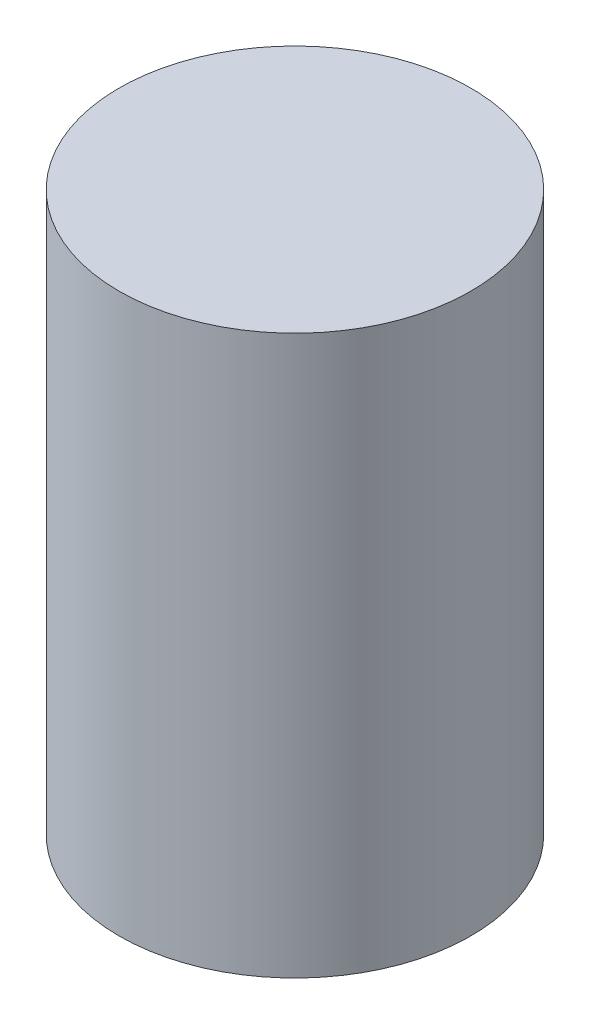
ISO-10303-21;
HEADER;
FILE_DESCRIPTION(('STEP AP214'),'2;1');
FILE_NAME('part.step','',(''),(''),'','','');
FILE_SCHEMA(('AUTOMOTIVE_DESIGN { 1 0 10303 214 1 1 1 1 }'));
ENDSEC;
DATA;
#1=APPLICATION_CONTEXT('core data for automotive mechanical design processes');
#2=APPLICATION_PROTOCOL_DEFINITION('international standard','automotive_design',2000,#1);
#3=PRODUCT_CONTEXT('',#1,'mechanical');
#4=PRODUCT('Part','Part','',(#3));
#5=PRODUCT_RELATED_PRODUCT_CATEGORY('part','',(#4));
#6=PRODUCT_DEFINITION_FORMATION('','',#4);
#7=PRODUCT_DEFINITION_CONTEXT('part definition',#1,'design');
#8=PRODUCT_DEFINITION('design','',#6,#7);
#9=PRODUCT_DEFINITION_SHAPE('','',#8);
#10=(LENGTH_UNIT() NAMED_UNIT(*) SI_UNIT(.MILLI.,.METRE.));
#11=(NAMED_UNIT(*) PLANE_ANGLE_UNIT() SI_UNIT($,.RADIAN.));
#12=(NAMED_UNIT(*) SI_UNIT($,.STERADIAN.) SOLID_ANGLE_UNIT());
#13=UNCERTAINTY_MEASURE_WITH_UNIT(LENGTH_MEASURE(1.E-05),#10,'distance_accuracy_value','');
#14=(GEOMETRIC_REPRESENTATION_CONTEXT(3) GLOBAL_UNCERTAINTY_ASSIGNED_CONTEXT((#13)) GLOBAL_UNIT_ASSIGNED_CONTEXT((#10,
#11,#12)) REPRESENTATION_CONTEXT('',''));
#15=CARTESIAN_POINT('',(0.,0.,0.));
#16=DIRECTION('',(0.,0.,1.));
#17=DIRECTION('',(1.,0.,0.));
#18=AXIS2_PLACEMENT_3D('',#15,#16,#17);
#19=CARTESIAN_POINT('',(0.,50.8,0.));
#20=DIRECTION('',(0.,-1.,0.));
#21=DIRECTION('',(0.,0.,-1.));
#22=AXIS2_PLACEMENT_3D('',#19,#20,#21);
#23=CYLINDRICAL_SURFACE('',#22,16.002);
#24=CARTESIAN_POINT('',(0.,50.8,0.));
#25=DIRECTION('',(0.,1.,0.));
#26=DIRECTION('',(0.,0.,1.));
#27=AXIS2_PLACEMENT_3D('',#24,#25,#26);
#28=CIRCLE('',#27,16.002);
#29=CARTESIAN_POINT('',(0.,50.8,16.002));
#30=VERTEX_POINT('',#29);
#31=EDGE_CURVE('E10',#30,#30,#28,.T.);
#32=ORIENTED_EDGE('',*,*,#31,.F.);
#33=EDGE_LOOP('',(#32));
#34=FACE_BOUND('',#33,.T.);
#35=CARTESIAN_POINT('',(0.,0.,0.));
#36=DIRECTION('',(0.,1.,0.));
#37=DIRECTION('',(0.,0.,1.));
#38=AXIS2_PLACEMENT_3D('',#35,#36,#37);
#39=CIRCLE('',#38,16.002);
#40=CARTESIAN_POINT('',(0.,0.,16.002));
#41=VERTEX_POINT('',#40);
#42=EDGE_CURVE('E34',#41,#41,#39,.T.);
#43=ORIENTED_EDGE('',*,*,#42,.T.);
#44=EDGE_LOOP('',(#43));
#45=FACE_BOUND('',#44,.T.);
#46=ADVANCED_FACE('F31',(#34,#45),#23,.T.);
#47=CARTESIAN_POINT('',(0.,50.8,0.));
#48=DIRECTION('',(0.,1.,0.));
#49=DIRECTION('',(0.,0.,1.));
#50=AXIS2_PLACEMENT_3D('',#47,#48,#49);
#51=PLANE('',#50);
#52=ORIENTED_EDGE('',*,*,#31,.T.);
#53=EDGE_LOOP('',(#52));
#54=FACE_BOUND('',#53,.T.);
#55=ADVANCED_FACE('F46',(#54),#51,.T.);
#56=CARTESIAN_POINT('',(0.,0.,0.));
#57=DIRECTION('',(0.,1.,0.));
#58=DIRECTION('',(0.,0.,1.));
#59=AXIS2_PLACEMENT_3D('',#56,#57,#58);
#60=PLANE('',#59);
#61=ORIENTED_EDGE('',*,*,#42,.F.);
#62=EDGE_LOOP('',(#61));
#63=FACE_BOUND('',#62,.T.);
#64=ADVANCED_FACE('F44',(#63),#60,.F.);
#65=CLOSED_SHELL('',(#46,#55,#64));
#66=MANIFOLD_SOLID_BREP('B2',#65);
#67=ADVANCED_BREP_SHAPE_REPRESENTATION('',(#18,#66),#14);
#68=SHAPE_DEFINITION_REPRESENTATION(#9,#67);
ENDSEC;
END-ISO-10303-21;
